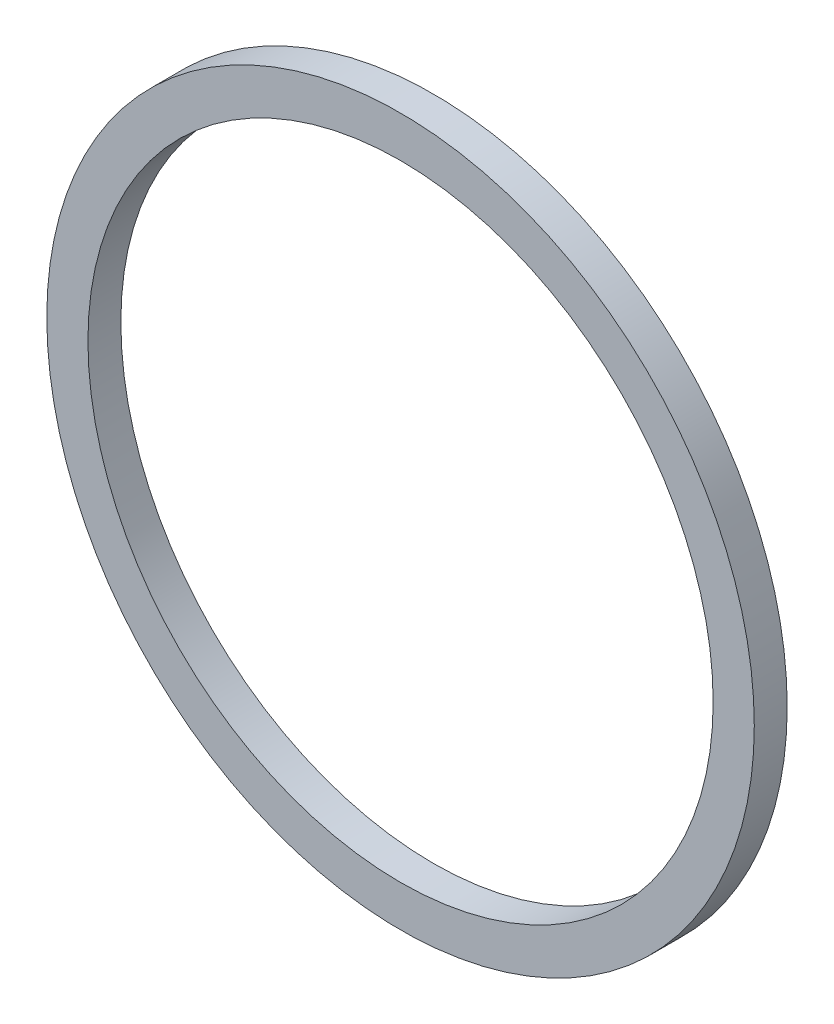
ISO-10303-21;
HEADER;
FILE_DESCRIPTION(('STEP AP214'),'2;1');
FILE_NAME('part.step','',(''),(''),'','','');
FILE_SCHEMA(('AUTOMOTIVE_DESIGN { 1 0 10303 214 1 1 1 1 }'));
ENDSEC;
DATA;
#1=APPLICATION_CONTEXT('core data for automotive mechanical design processes');
#2=APPLICATION_PROTOCOL_DEFINITION('international standard','automotive_design',2000,#1);
#3=PRODUCT_CONTEXT('',#1,'mechanical');
#4=PRODUCT('Part','Part','',(#3));
#5=PRODUCT_RELATED_PRODUCT_CATEGORY('part','',(#4));
#6=PRODUCT_DEFINITION_FORMATION('','',#4);
#7=PRODUCT_DEFINITION_CONTEXT('part definition',#1,'design');
#8=PRODUCT_DEFINITION('design','',#6,#7);
#9=PRODUCT_DEFINITION_SHAPE('','',#8);
#10=(LENGTH_UNIT() NAMED_UNIT(*) SI_UNIT(.MILLI.,.METRE.));
#11=(NAMED_UNIT(*) PLANE_ANGLE_UNIT() SI_UNIT($,.RADIAN.));
#12=(NAMED_UNIT(*) SI_UNIT($,.STERADIAN.) SOLID_ANGLE_UNIT());
#13=UNCERTAINTY_MEASURE_WITH_UNIT(LENGTH_MEASURE(1.E-05),#10,'distance_accuracy_value','');
#14=(GEOMETRIC_REPRESENTATION_CONTEXT(3) GLOBAL_UNCERTAINTY_ASSIGNED_CONTEXT((#13)) GLOBAL_UNIT_ASSIGNED_CONTEXT((#10,
#11,#12)) REPRESENTATION_CONTEXT('',''));
#15=CARTESIAN_POINT('',(0.,0.,0.));
#16=DIRECTION('',(0.,0.,1.));
#17=DIRECTION('',(1.,0.,0.));
#18=AXIS2_PLACEMENT_3D('',#15,#16,#17);
#19=CARTESIAN_POINT('',(0.,0.,4.));
#20=DIRECTION('',(0.,0.,1.));
#21=DIRECTION('',(1.,0.,0.));
#22=AXIS2_PLACEMENT_3D('',#19,#20,#21);
#23=PLANE('',#22);
#24=CARTESIAN_POINT('',(0.,0.,4.));
#25=DIRECTION('',(0.,0.,1.));
#26=DIRECTION('',(1.,0.,0.));
#27=AXIS2_PLACEMENT_3D('',#24,#25,#26);
#28=CIRCLE('',#27,43.);
#29=CARTESIAN_POINT('',(43.,0.,4.));
#30=VERTEX_POINT('',#29);
#31=EDGE_CURVE('E10',#30,#30,#28,.T.);
#32=ORIENTED_EDGE('',*,*,#31,.T.);
#33=EDGE_LOOP('',(#32));
#34=FACE_BOUND('',#33,.T.);
#35=CARTESIAN_POINT('',(0.,0.,4.));
#36=DIRECTION('',(0.,0.,1.));
#37=DIRECTION('',(1.,0.,0.));
#38=AXIS2_PLACEMENT_3D('',#35,#36,#37);
#39=CIRCLE('',#38,38.);
#40=CARTESIAN_POINT('',(38.,0.,4.));
#41=VERTEX_POINT('',#40);
#42=EDGE_CURVE('E50',#41,#41,#39,.T.);
#43=ORIENTED_EDGE('',*,*,#42,.F.);
#44=EDGE_LOOP('',(#43));
#45=FACE_BOUND('',#44,.T.);
#46=ADVANCED_FACE('F39',(#34,#45),#23,.T.);
#47=CARTESIAN_POINT('',(0.,0.,0.));
#48=DIRECTION('',(0.,0.,1.));
#49=DIRECTION('',(1.,0.,0.));
#50=AXIS2_PLACEMENT_3D('',#47,#48,#49);
#51=PLANE('',#50);
#52=CARTESIAN_POINT('',(0.,0.,0.));
#53=DIRECTION('',(0.,0.,1.));
#54=DIRECTION('',(1.,0.,0.));
#55=AXIS2_PLACEMENT_3D('',#52,#53,#54);
#56=CIRCLE('',#55,43.);
#57=CARTESIAN_POINT('',(43.,0.,0.));
#58=VERTEX_POINT('',#57);
#59=EDGE_CURVE('E43',#58,#58,#56,.T.);
#60=ORIENTED_EDGE('',*,*,#59,.F.);
#61=EDGE_LOOP('',(#60));
#62=FACE_BOUND('',#61,.T.);
#63=CARTESIAN_POINT('',(0.,0.,0.));
#64=DIRECTION('',(0.,0.,1.));
#65=DIRECTION('',(1.,0.,0.));
#66=AXIS2_PLACEMENT_3D('',#63,#64,#65);
#67=CIRCLE('',#66,38.);
#68=CARTESIAN_POINT('',(38.,0.,0.));
#69=VERTEX_POINT('',#68);
#70=EDGE_CURVE('E52',#69,#69,#67,.T.);
#71=ORIENTED_EDGE('',*,*,#70,.T.);
#72=EDGE_LOOP('',(#71));
#73=FACE_BOUND('',#72,.T.);
#74=ADVANCED_FACE('F62',(#62,#73),#51,.F.);
#75=CARTESIAN_POINT('',(0.,0.,4.));
#76=DIRECTION('',(0.,0.,-1.));
#77=DIRECTION('',(-1.,0.,0.));
#78=AXIS2_PLACEMENT_3D('',#75,#76,#77);
#79=CYLINDRICAL_SURFACE('',#78,43.);
#80=ORIENTED_EDGE('',*,*,#31,.F.);
#81=EDGE_LOOP('',(#80));
#82=FACE_BOUND('',#81,.T.);
#83=ORIENTED_EDGE('',*,*,#59,.T.);
#84=EDGE_LOOP('',(#83));
#85=FACE_BOUND('',#84,.T.);
#86=ADVANCED_FACE('F41',(#82,#85),#79,.T.);
#87=CARTESIAN_POINT('',(0.,0.,4.));
#88=DIRECTION('',(0.,0.,-1.));
#89=DIRECTION('',(-1.,0.,0.));
#90=AXIS2_PLACEMENT_3D('',#87,#88,#89);
#91=CYLINDRICAL_SURFACE('',#90,38.);
#92=ORIENTED_EDGE('',*,*,#42,.T.);
#93=EDGE_LOOP('',(#92));
#94=FACE_BOUND('',#93,.T.);
#95=ORIENTED_EDGE('',*,*,#70,.F.);
#96=EDGE_LOOP('',(#95));
#97=FACE_BOUND('',#96,.T.);
#98=ADVANCED_FACE('F58',(#94,#97),#91,.F.);
#99=CLOSED_SHELL('',(#46,#74,#86,#98));
#100=MANIFOLD_SOLID_BREP('B2',#99);
#101=ADVANCED_BREP_SHAPE_REPRESENTATION('',(#18,#100),#14);
#102=SHAPE_DEFINITION_REPRESENTATION(#9,#101);
ENDSEC;
END-ISO-10303-21;
